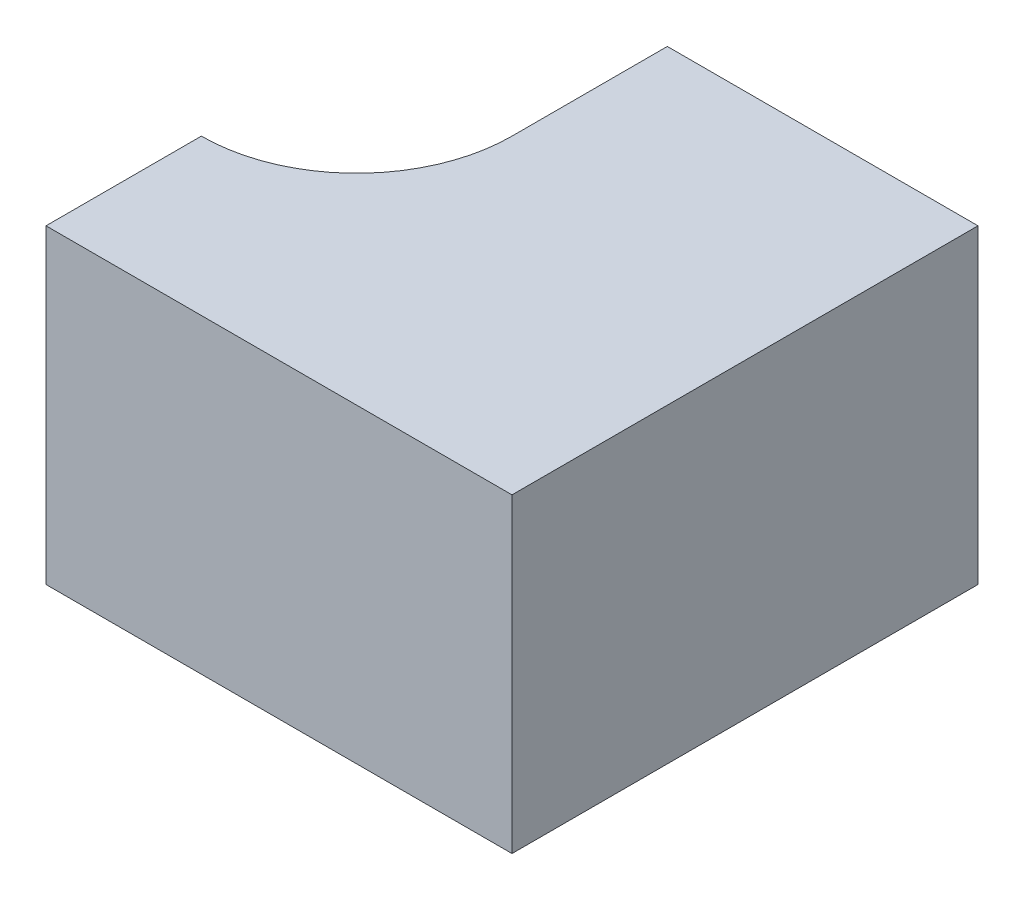
ISO-10303-21;
HEADER;
FILE_DESCRIPTION(('STEP AP214'),'2;1');
FILE_NAME('part.step','',(''),(''),'','','');
FILE_SCHEMA(('AUTOMOTIVE_DESIGN { 1 0 10303 214 1 1 1 1 }'));
ENDSEC;
DATA;
#1=APPLICATION_CONTEXT('core data for automotive mechanical design processes');
#2=APPLICATION_PROTOCOL_DEFINITION('international standard','automotive_design',2000,#1);
#3=PRODUCT_CONTEXT('',#1,'mechanical');
#4=PRODUCT('Part','Part','',(#3));
#5=PRODUCT_RELATED_PRODUCT_CATEGORY('part','',(#4));
#6=PRODUCT_DEFINITION_FORMATION('','',#4);
#7=PRODUCT_DEFINITION_CONTEXT('part definition',#1,'design');
#8=PRODUCT_DEFINITION('design','',#6,#7);
#9=PRODUCT_DEFINITION_SHAPE('','',#8);
#10=(LENGTH_UNIT() NAMED_UNIT(*) SI_UNIT(.MILLI.,.METRE.));
#11=(NAMED_UNIT(*) PLANE_ANGLE_UNIT() SI_UNIT($,.RADIAN.));
#12=(NAMED_UNIT(*) SI_UNIT($,.STERADIAN.) SOLID_ANGLE_UNIT());
#13=UNCERTAINTY_MEASURE_WITH_UNIT(LENGTH_MEASURE(1.E-05),#10,'distance_accuracy_value','');
#14=(GEOMETRIC_REPRESENTATION_CONTEXT(3) GLOBAL_UNCERTAINTY_ASSIGNED_CONTEXT((#13)) GLOBAL_UNIT_ASSIGNED_CONTEXT((#10,
#11,#12)) REPRESENTATION_CONTEXT('',''));
#15=CARTESIAN_POINT('',(0.,0.,0.));
#16=DIRECTION('',(0.,0.,1.));
#17=DIRECTION('',(1.,0.,0.));
#18=AXIS2_PLACEMENT_3D('',#15,#16,#17);
#19=CARTESIAN_POINT('',(40.,20.,0.));
#20=DIRECTION('',(0.,0.,1.));
#21=DIRECTION('',(-1.,0.,0.));
#22=AXIS2_PLACEMENT_3D('',#19,#20,#21);
#23=PLANE('',#22);
#24=DIRECTION('',(1.,0.,0.));
#25=VECTOR('',#24,1.);
#26=CARTESIAN_POINT('',(40.,0.,0.));
#27=LINE('',#26,#25);
#28=CARTESIAN_POINT('',(20.,0.,0.));
#29=VERTEX_POINT('',#28);
#30=CARTESIAN_POINT('',(40.,0.,0.));
#31=VERTEX_POINT('',#30);
#32=EDGE_CURVE('E128',#29,#31,#27,.T.);
#33=ORIENTED_EDGE('',*,*,#32,.F.);
#34=DIRECTION('',(0.,-1.,0.));
#35=VECTOR('',#34,1.);
#36=CARTESIAN_POINT('',(20.,20.,0.));
#37=LINE('',#36,#35);
#38=CARTESIAN_POINT('',(20.,20.,0.));
#39=VERTEX_POINT('',#38);
#40=EDGE_CURVE('E127',#39,#29,#37,.T.);
#41=ORIENTED_EDGE('',*,*,#40,.F.);
#42=DIRECTION('',(1.,0.,0.));
#43=VECTOR('',#42,1.);
#44=CARTESIAN_POINT('',(40.,20.,0.));
#45=LINE('',#44,#43);
#46=CARTESIAN_POINT('',(40.,20.,0.));
#47=VERTEX_POINT('',#46);
#48=EDGE_CURVE('E146',#39,#47,#45,.T.);
#49=ORIENTED_EDGE('',*,*,#48,.T.);
#50=DIRECTION('',(0.,-1.,0.));
#51=VECTOR('',#50,1.);
#52=CARTESIAN_POINT('',(40.,20.,0.));
#53=LINE('',#52,#51);
#54=EDGE_CURVE('E11',#47,#31,#53,.T.);
#55=ORIENTED_EDGE('',*,*,#54,.T.);
#56=EDGE_LOOP('',(#33,#41,#49,#55));
#57=FACE_BOUND('',#56,.T.);
#58=ADVANCED_FACE('F39',(#57),#23,.F.);
#59=CARTESIAN_POINT('',(40.,20.,30.));
#60=DIRECTION('',(-1.,0.,0.));
#61=DIRECTION('',(0.,0.,-1.));
#62=AXIS2_PLACEMENT_3D('',#59,#60,#61);
#63=PLANE('',#62);
#64=DIRECTION('',(0.,0.,1.));
#65=VECTOR('',#64,1.);
#66=CARTESIAN_POINT('',(40.,0.,30.));
#67=LINE('',#66,#65);
#68=CARTESIAN_POINT('',(40.,0.,30.));
#69=VERTEX_POINT('',#68);
#70=EDGE_CURVE('E131',#31,#69,#67,.T.);
#71=ORIENTED_EDGE('',*,*,#70,.F.);
#72=ORIENTED_EDGE('',*,*,#54,.F.);
#73=DIRECTION('',(0.,0.,1.));
#74=VECTOR('',#73,1.);
#75=CARTESIAN_POINT('',(40.,20.,30.));
#76=LINE('',#75,#74);
#77=CARTESIAN_POINT('',(40.,20.,30.));
#78=VERTEX_POINT('',#77);
#79=EDGE_CURVE('E88',#47,#78,#76,.T.);
#80=ORIENTED_EDGE('',*,*,#79,.T.);
#81=DIRECTION('',(0.,-1.,0.));
#82=VECTOR('',#81,1.);
#83=CARTESIAN_POINT('',(40.,20.,30.));
#84=LINE('',#83,#82);
#85=EDGE_CURVE('E48',#78,#69,#84,.T.);
#86=ORIENTED_EDGE('',*,*,#85,.T.);
#87=EDGE_LOOP('',(#71,#72,#80,#86));
#88=FACE_BOUND('',#87,.T.);
#89=ADVANCED_FACE('F156',(#88),#63,.F.);
#90=CARTESIAN_POINT('',(10.,20.,30.));
#91=DIRECTION('',(0.,0.,-1.));
#92=DIRECTION('',(1.,0.,0.));
#93=AXIS2_PLACEMENT_3D('',#90,#91,#92);
#94=PLANE('',#93);
#95=DIRECTION('',(-1.,0.,0.));
#96=VECTOR('',#95,1.);
#97=CARTESIAN_POINT('',(10.,0.,30.));
#98=LINE('',#97,#96);
#99=CARTESIAN_POINT('',(10.,0.,30.));
#100=VERTEX_POINT('',#99);
#101=EDGE_CURVE('E135',#69,#100,#98,.T.);
#102=ORIENTED_EDGE('',*,*,#101,.F.);
#103=ORIENTED_EDGE('',*,*,#85,.F.);
#104=DIRECTION('',(-1.,0.,0.));
#105=VECTOR('',#104,1.);
#106=CARTESIAN_POINT('',(10.,20.,30.));
#107=LINE('',#106,#105);
#108=CARTESIAN_POINT('',(10.,20.,30.));
#109=VERTEX_POINT('',#108);
#110=EDGE_CURVE('E119',#78,#109,#107,.T.);
#111=ORIENTED_EDGE('',*,*,#110,.T.);
#112=DIRECTION('',(0.,-1.,0.));
#113=VECTOR('',#112,1.);
#114=CARTESIAN_POINT('',(10.,20.,30.));
#115=LINE('',#114,#113);
#116=EDGE_CURVE('E112',#109,#100,#115,.T.);
#117=ORIENTED_EDGE('',*,*,#116,.T.);
#118=EDGE_LOOP('',(#102,#103,#111,#117));
#119=FACE_BOUND('',#118,.T.);
#120=ADVANCED_FACE('F180',(#119),#94,.F.);
#121=CARTESIAN_POINT('',(10.,20.,20.));
#122=DIRECTION('',(1.,0.,0.));
#123=DIRECTION('',(0.,0.,1.));
#124=AXIS2_PLACEMENT_3D('',#121,#122,#123);
#125=PLANE('',#124);
#126=DIRECTION('',(0.,0.,-1.));
#127=VECTOR('',#126,1.);
#128=CARTESIAN_POINT('',(10.,0.,20.));
#129=LINE('',#128,#127);
#130=CARTESIAN_POINT('',(10.,0.,20.));
#131=VERTEX_POINT('',#130);
#132=EDGE_CURVE('E139',#100,#131,#129,.T.);
#133=ORIENTED_EDGE('',*,*,#132,.F.);
#134=ORIENTED_EDGE('',*,*,#116,.F.);
#135=DIRECTION('',(0.,0.,-1.));
#136=VECTOR('',#135,1.);
#137=CARTESIAN_POINT('',(10.,20.,20.));
#138=LINE('',#137,#136);
#139=CARTESIAN_POINT('',(10.,20.,20.));
#140=VERTEX_POINT('',#139);
#141=EDGE_CURVE('E100',#109,#140,#138,.T.);
#142=ORIENTED_EDGE('',*,*,#141,.T.);
#143=DIRECTION('',(0.,-1.,0.));
#144=VECTOR('',#143,1.);
#145=CARTESIAN_POINT('',(10.,20.,20.));
#146=LINE('',#145,#144);
#147=EDGE_CURVE('E106',#140,#131,#146,.T.);
#148=ORIENTED_EDGE('',*,*,#147,.T.);
#149=EDGE_LOOP('',(#133,#134,#142,#148));
#150=FACE_BOUND('',#149,.T.);
#151=ADVANCED_FACE('F115',(#150),#125,.F.);
#152=CARTESIAN_POINT('',(10.,20.,10.));
#153=DIRECTION('',(0.,-1.,0.));
#154=DIRECTION('',(0.,0.,-1.));
#155=AXIS2_PLACEMENT_3D('',#152,#153,#154);
#156=CYLINDRICAL_SURFACE('',#155,10.);
#157=CARTESIAN_POINT('',(10.,0.,10.));
#158=DIRECTION('',(0.,1.,0.));
#159=DIRECTION('',(0.,0.,1.));
#160=AXIS2_PLACEMENT_3D('',#157,#158,#159);
#161=CIRCLE('',#160,10.);
#162=CARTESIAN_POINT('',(20.,0.,10.));
#163=VERTEX_POINT('',#162);
#164=EDGE_CURVE('E108',#131,#163,#161,.T.);
#165=ORIENTED_EDGE('',*,*,#164,.F.);
#166=ORIENTED_EDGE('',*,*,#147,.F.);
#167=CARTESIAN_POINT('',(10.,20.,10.));
#168=DIRECTION('',(0.,1.,0.));
#169=DIRECTION('',(0.,0.,1.));
#170=AXIS2_PLACEMENT_3D('',#167,#168,#169);
#171=CIRCLE('',#170,10.);
#172=CARTESIAN_POINT('',(20.,20.,10.));
#173=VERTEX_POINT('',#172);
#174=EDGE_CURVE('E96',#140,#173,#171,.T.);
#175=ORIENTED_EDGE('',*,*,#174,.T.);
#176=DIRECTION('',(0.,-1.,0.));
#177=VECTOR('',#176,1.);
#178=CARTESIAN_POINT('',(20.,20.,10.));
#179=LINE('',#178,#177);
#180=EDGE_CURVE('E113',#173,#163,#179,.T.);
#181=ORIENTED_EDGE('',*,*,#180,.T.);
#182=EDGE_LOOP('',(#165,#166,#175,#181));
#183=FACE_BOUND('',#182,.T.);
#184=ADVANCED_FACE('F107',(#183),#156,.F.);
#185=CARTESIAN_POINT('',(20.,20.,0.));
#186=DIRECTION('',(1.,0.,0.));
#187=DIRECTION('',(0.,0.,1.));
#188=AXIS2_PLACEMENT_3D('',#185,#186,#187);
#189=PLANE('',#188);
#190=DIRECTION('',(0.,0.,-1.));
#191=VECTOR('',#190,1.);
#192=CARTESIAN_POINT('',(20.,0.,0.));
#193=LINE('',#192,#191);
#194=EDGE_CURVE('E76',#163,#29,#193,.T.);
#195=ORIENTED_EDGE('',*,*,#194,.F.);
#196=ORIENTED_EDGE('',*,*,#180,.F.);
#197=DIRECTION('',(0.,0.,-1.));
#198=VECTOR('',#197,1.);
#199=CARTESIAN_POINT('',(20.,20.,0.));
#200=LINE('',#199,#198);
#201=EDGE_CURVE('E56',#173,#39,#200,.T.);
#202=ORIENTED_EDGE('',*,*,#201,.T.);
#203=ORIENTED_EDGE('',*,*,#40,.T.);
#204=EDGE_LOOP('',(#195,#196,#202,#203));
#205=FACE_BOUND('',#204,.T.);
#206=ADVANCED_FACE('F166',(#205),#189,.F.);
#207=CARTESIAN_POINT('',(10.,20.,10.));
#208=DIRECTION('',(0.,1.,0.));
#209=DIRECTION('',(0.,0.,1.));
#210=AXIS2_PLACEMENT_3D('',#207,#208,#209);
#211=PLANE('',#210);
#212=ORIENTED_EDGE('',*,*,#48,.F.);
#213=ORIENTED_EDGE('',*,*,#201,.F.);
#214=ORIENTED_EDGE('',*,*,#174,.F.);
#215=ORIENTED_EDGE('',*,*,#141,.F.);
#216=ORIENTED_EDGE('',*,*,#110,.F.);
#217=ORIENTED_EDGE('',*,*,#79,.F.);
#218=EDGE_LOOP('',(#212,#213,#214,#215,#216,#217));
#219=FACE_BOUND('',#218,.T.);
#220=ADVANCED_FACE('F98',(#219),#211,.T.);
#221=CARTESIAN_POINT('',(10.,0.,10.));
#222=DIRECTION('',(0.,1.,0.));
#223=DIRECTION('',(0.,0.,1.));
#224=AXIS2_PLACEMENT_3D('',#221,#222,#223);
#225=PLANE('',#224);
#226=ORIENTED_EDGE('',*,*,#32,.T.);
#227=ORIENTED_EDGE('',*,*,#70,.T.);
#228=ORIENTED_EDGE('',*,*,#101,.T.);
#229=ORIENTED_EDGE('',*,*,#132,.T.);
#230=ORIENTED_EDGE('',*,*,#164,.T.);
#231=ORIENTED_EDGE('',*,*,#194,.T.);
#232=EDGE_LOOP('',(#226,#227,#228,#229,#230,#231));
#233=FACE_BOUND('',#232,.T.);
#234=ADVANCED_FACE('F158',(#233),#225,.F.);
#235=CLOSED_SHELL('',(#58,#89,#120,#151,#184,#206,#220,#234));
#236=MANIFOLD_SOLID_BREP('B2',#235);
#237=ADVANCED_BREP_SHAPE_REPRESENTATION('',(#18,#236),#14);
#238=SHAPE_DEFINITION_REPRESENTATION(#9,#237);
ENDSEC;
END-ISO-10303-21;
